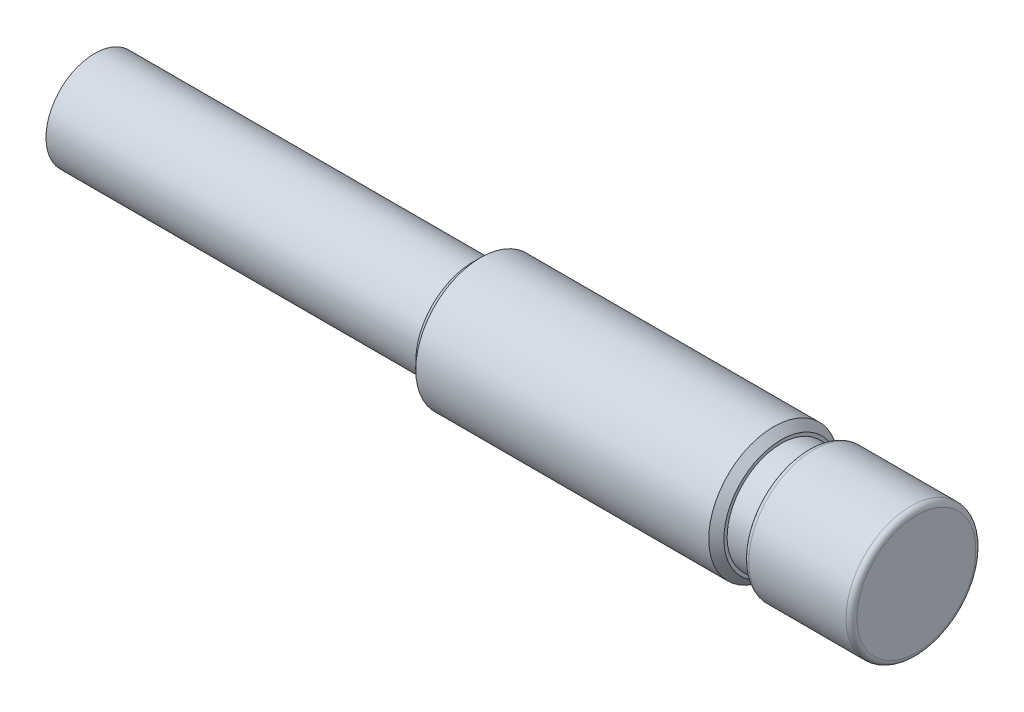
ISO-10303-21;
HEADER;
FILE_DESCRIPTION(('STEP AP214'),'2;1');
FILE_NAME('part.step','',(''),(''),'','','');
FILE_SCHEMA(('AUTOMOTIVE_DESIGN { 1 0 10303 214 1 1 1 1 }'));
ENDSEC;
DATA;
#1=APPLICATION_CONTEXT('core data for automotive mechanical design processes');
#2=APPLICATION_PROTOCOL_DEFINITION('international standard','automotive_design',2000,#1);
#3=PRODUCT_CONTEXT('',#1,'mechanical');
#4=PRODUCT('Part','Part','',(#3));
#5=PRODUCT_RELATED_PRODUCT_CATEGORY('part','',(#4));
#6=PRODUCT_DEFINITION_FORMATION('','',#4);
#7=PRODUCT_DEFINITION_CONTEXT('part definition',#1,'design');
#8=PRODUCT_DEFINITION('design','',#6,#7);
#9=PRODUCT_DEFINITION_SHAPE('','',#8);
#10=(LENGTH_UNIT() NAMED_UNIT(*) SI_UNIT(.MILLI.,.METRE.));
#11=(NAMED_UNIT(*) PLANE_ANGLE_UNIT() SI_UNIT($,.RADIAN.));
#12=(NAMED_UNIT(*) SI_UNIT($,.STERADIAN.) SOLID_ANGLE_UNIT());
#13=UNCERTAINTY_MEASURE_WITH_UNIT(LENGTH_MEASURE(1.E-05),#10,'distance_accuracy_value','');
#14=(GEOMETRIC_REPRESENTATION_CONTEXT(3) GLOBAL_UNCERTAINTY_ASSIGNED_CONTEXT((#13)) GLOBAL_UNIT_ASSIGNED_CONTEXT((#10,
#11,#12)) REPRESENTATION_CONTEXT('',''));
#15=CARTESIAN_POINT('',(0.,0.,0.));
#16=DIRECTION('',(0.,0.,1.));
#17=DIRECTION('',(1.,0.,0.));
#18=AXIS2_PLACEMENT_3D('',#15,#16,#17);
#19=CARTESIAN_POINT('',(0.,0.,0.));
#20=DIRECTION('',(-1.,0.,0.));
#21=DIRECTION('',(0.,-1.,0.));
#22=AXIS2_PLACEMENT_3D('',#19,#20,#21);
#23=PLANE('',#22);
#24=CARTESIAN_POINT('',(0.,0.,0.));
#25=DIRECTION('',(-1.,0.,0.));
#26=DIRECTION('',(0.,-1.,0.));
#27=AXIS2_PLACEMENT_3D('',#24,#25,#26);
#28=CIRCLE('',#27,4.20000000000002);
#29=CARTESIAN_POINT('',(0.,-4.20000000000001,0.));
#30=VERTEX_POINT('',#29);
#31=EDGE_CURVE('E43',#30,#30,#28,.F.);
#32=ORIENTED_EDGE('',*,*,#31,.T.);
#33=EDGE_LOOP('',(#32));
#34=FACE_BOUND('',#33,.T.);
#35=CARTESIAN_POINT('',(0.,0.,0.));
#36=DIRECTION('',(1.,0.,0.));
#37=DIRECTION('',(0.,1.,0.));
#38=AXIS2_PLACEMENT_3D('',#35,#36,#37);
#39=CIRCLE('',#38,4.5);
#40=CARTESIAN_POINT('',(0.,4.5,0.));
#41=VERTEX_POINT('',#40);
#42=EDGE_CURVE('E77',#41,#41,#39,.T.);
#43=ORIENTED_EDGE('',*,*,#42,.F.);
#44=EDGE_LOOP('',(#43));
#45=FACE_BOUND('',#44,.T.);
#46=ADVANCED_FACE('F36',(#34,#45),#23,.T.);
#47=CARTESIAN_POINT('',(76.,0.,0.));
#48=DIRECTION('',(1.,0.,0.));
#49=DIRECTION('',(0.,1.,0.));
#50=AXIS2_PLACEMENT_3D('',#47,#48,#49);
#51=CYLINDRICAL_SURFACE('',#50,4.5);
#52=ORIENTED_EDGE('',*,*,#42,.T.);
#53=EDGE_LOOP('',(#52));
#54=FACE_BOUND('',#53,.T.);
#55=CARTESIAN_POINT('',(35.,0.,0.));
#56=DIRECTION('',(1.,0.,0.));
#57=DIRECTION('',(0.,1.,0.));
#58=AXIS2_PLACEMENT_3D('',#55,#56,#57);
#59=CIRCLE('',#58,4.5);
#60=CARTESIAN_POINT('',(35.,4.5,0.));
#61=VERTEX_POINT('',#60);
#62=EDGE_CURVE('E80',#61,#61,#59,.T.);
#63=ORIENTED_EDGE('',*,*,#62,.F.);
#64=EDGE_LOOP('',(#63));
#65=FACE_BOUND('',#64,.T.);
#66=ADVANCED_FACE('F108',(#54,#65),#51,.T.);
#67=CARTESIAN_POINT('',(35.,4.5,0.));
#68=DIRECTION('',(-1.,0.,0.));
#69=DIRECTION('',(0.,-1.,0.));
#70=AXIS2_PLACEMENT_3D('',#67,#68,#69);
#71=PLANE('',#70);
#72=CARTESIAN_POINT('',(35.,0.,0.));
#73=DIRECTION('',(-1.,0.,0.));
#74=DIRECTION('',(0.,-1.,0.));
#75=AXIS2_PLACEMENT_3D('',#72,#73,#74);
#76=CIRCLE('',#75,5.29999999999999);
#77=CARTESIAN_POINT('',(35.,-5.29999999999999,0.));
#78=VERTEX_POINT('',#77);
#79=EDGE_CURVE('E65',#78,#78,#76,.T.);
#80=ORIENTED_EDGE('',*,*,#79,.T.);
#81=EDGE_LOOP('',(#80));
#82=FACE_BOUND('',#81,.T.);
#83=ORIENTED_EDGE('',*,*,#62,.T.);
#84=EDGE_LOOP('',(#83));
#85=FACE_BOUND('',#84,.T.);
#86=ADVANCED_FACE('F113',(#82,#85),#71,.T.);
#87=CARTESIAN_POINT('',(76.,0.,0.));
#88=DIRECTION('',(1.,0.,0.));
#89=DIRECTION('',(0.,1.,0.));
#90=AXIS2_PLACEMENT_3D('',#87,#88,#89);
#91=CYLINDRICAL_SURFACE('',#90,5.99999999999999);
#92=CARTESIAN_POINT('',(62.8,0.,0.));
#93=DIRECTION('',(1.,0.,0.));
#94=DIRECTION('',(0.,1.,0.));
#95=AXIS2_PLACEMENT_3D('',#92,#93,#94);
#96=CIRCLE('',#95,5.99999999999999);
#97=CARTESIAN_POINT('',(62.8,5.99999999999999,0.));
#98=VERTEX_POINT('',#97);
#99=EDGE_CURVE('E68',#98,#98,#96,.F.);
#100=ORIENTED_EDGE('',*,*,#99,.T.);
#101=EDGE_LOOP('',(#100));
#102=FACE_BOUND('',#101,.T.);
#103=CARTESIAN_POINT('',(35.7,0.,0.));
#104=DIRECTION('',(-1.,0.,0.));
#105=DIRECTION('',(0.,-1.,0.));
#106=AXIS2_PLACEMENT_3D('',#103,#104,#105);
#107=CIRCLE('',#106,5.99999999999999);
#108=CARTESIAN_POINT('',(35.7,-5.99999999999999,0.));
#109=VERTEX_POINT('',#108);
#110=EDGE_CURVE('E71',#109,#109,#107,.F.);
#111=ORIENTED_EDGE('',*,*,#110,.T.);
#112=EDGE_LOOP('',(#111));
#113=FACE_BOUND('',#112,.T.);
#114=ADVANCED_FACE('F104',(#102,#113),#91,.T.);
#115=CARTESIAN_POINT('',(63.5,6.,0.));
#116=DIRECTION('',(1.,0.,0.));
#117=DIRECTION('',(0.,1.,0.));
#118=AXIS2_PLACEMENT_3D('',#115,#116,#117);
#119=PLANE('',#118);
#120=CARTESIAN_POINT('',(63.5,0.,0.));
#121=DIRECTION('',(1.,0.,0.));
#122=DIRECTION('',(0.,1.,0.));
#123=AXIS2_PLACEMENT_3D('',#120,#121,#122);
#124=CIRCLE('',#123,5.29999999999999);
#125=CARTESIAN_POINT('',(63.5,5.29999999999999,0.));
#126=VERTEX_POINT('',#125);
#127=EDGE_CURVE('E74',#126,#126,#124,.T.);
#128=ORIENTED_EDGE('',*,*,#127,.T.);
#129=EDGE_LOOP('',(#128));
#130=FACE_BOUND('',#129,.T.);
#131=CARTESIAN_POINT('',(63.5,0.,0.));
#132=DIRECTION('',(1.,0.,0.));
#133=DIRECTION('',(0.,1.,0.));
#134=AXIS2_PLACEMENT_3D('',#131,#132,#133);
#135=CIRCLE('',#134,4.99999999999999);
#136=CARTESIAN_POINT('',(63.5,4.99999999999999,0.));
#137=VERTEX_POINT('',#136);
#138=EDGE_CURVE('E83',#137,#137,#135,.T.);
#139=ORIENTED_EDGE('',*,*,#138,.F.);
#140=EDGE_LOOP('',(#139));
#141=FACE_BOUND('',#140,.T.);
#142=ADVANCED_FACE('F94',(#130,#141),#119,.T.);
#143=CARTESIAN_POINT('',(76.,0.,0.));
#144=DIRECTION('',(1.,0.,0.));
#145=DIRECTION('',(0.,1.,0.));
#146=AXIS2_PLACEMENT_3D('',#143,#144,#145);
#147=CYLINDRICAL_SURFACE('',#146,4.99999999999999);
#148=ORIENTED_EDGE('',*,*,#138,.T.);
#149=EDGE_LOOP('',(#148));
#150=FACE_BOUND('',#149,.T.);
#151=CARTESIAN_POINT('',(66.,0.,0.));
#152=DIRECTION('',(1.,0.,0.));
#153=DIRECTION('',(0.,1.,0.));
#154=AXIS2_PLACEMENT_3D('',#151,#152,#153);
#155=CIRCLE('',#154,4.99999999999999);
#156=CARTESIAN_POINT('',(66.,4.99999999999999,0.));
#157=VERTEX_POINT('',#156);
#158=EDGE_CURVE('E86',#157,#157,#155,.T.);
#159=ORIENTED_EDGE('',*,*,#158,.F.);
#160=EDGE_LOOP('',(#159));
#161=FACE_BOUND('',#160,.T.);
#162=ADVANCED_FACE('F92',(#150,#161),#147,.T.);
#163=CARTESIAN_POINT('',(66.,4.99999999999999,0.));
#164=DIRECTION('',(-1.,0.,0.));
#165=DIRECTION('',(0.,-1.,0.));
#166=AXIS2_PLACEMENT_3D('',#163,#164,#165);
#167=PLANE('',#166);
#168=CARTESIAN_POINT('',(66.,0.,0.));
#169=DIRECTION('',(-1.,0.,0.));
#170=DIRECTION('',(0.,-1.,0.));
#171=AXIS2_PLACEMENT_3D('',#168,#169,#170);
#172=CIRCLE('',#171,5.49999999999999);
#173=CARTESIAN_POINT('',(66.,-5.49999999999999,0.));
#174=VERTEX_POINT('',#173);
#175=EDGE_CURVE('E51',#174,#174,#172,.T.);
#176=ORIENTED_EDGE('',*,*,#175,.T.);
#177=EDGE_LOOP('',(#176));
#178=FACE_BOUND('',#177,.T.);
#179=ORIENTED_EDGE('',*,*,#158,.T.);
#180=EDGE_LOOP('',(#179));
#181=FACE_BOUND('',#180,.T.);
#182=ADVANCED_FACE('F90',(#178,#181),#167,.T.);
#183=CARTESIAN_POINT('',(76.,0.,0.));
#184=DIRECTION('',(1.,0.,0.));
#185=DIRECTION('',(0.,1.,0.));
#186=AXIS2_PLACEMENT_3D('',#183,#184,#185);
#187=CYLINDRICAL_SURFACE('',#186,5.99999999999999);
#188=CARTESIAN_POINT('',(75.5,0.,0.));
#189=DIRECTION('',(1.,0.,0.));
#190=DIRECTION('',(0.,1.,0.));
#191=AXIS2_PLACEMENT_3D('',#188,#189,#190);
#192=CIRCLE('',#191,5.99999999999999);
#193=CARTESIAN_POINT('',(75.5,5.99999999999999,0.));
#194=VERTEX_POINT('',#193);
#195=EDGE_CURVE('E56',#194,#194,#192,.F.);
#196=ORIENTED_EDGE('',*,*,#195,.T.);
#197=EDGE_LOOP('',(#196));
#198=FACE_BOUND('',#197,.T.);
#199=CARTESIAN_POINT('',(66.5,0.,0.));
#200=DIRECTION('',(-1.,0.,0.));
#201=DIRECTION('',(0.,-1.,0.));
#202=AXIS2_PLACEMENT_3D('',#199,#200,#201);
#203=CIRCLE('',#202,5.99999999999999);
#204=CARTESIAN_POINT('',(66.5,-5.99999999999999,0.));
#205=VERTEX_POINT('',#204);
#206=EDGE_CURVE('E59',#205,#205,#203,.F.);
#207=ORIENTED_EDGE('',*,*,#206,.T.);
#208=EDGE_LOOP('',(#207));
#209=FACE_BOUND('',#208,.T.);
#210=ADVANCED_FACE('F101',(#198,#209),#187,.T.);
#211=CARTESIAN_POINT('',(76.,6.,0.));
#212=DIRECTION('',(1.,0.,0.));
#213=DIRECTION('',(0.,1.,0.));
#214=AXIS2_PLACEMENT_3D('',#211,#212,#213);
#215=PLANE('',#214);
#216=CARTESIAN_POINT('',(76.,0.,0.));
#217=DIRECTION('',(1.,0.,0.));
#218=DIRECTION('',(0.,1.,0.));
#219=AXIS2_PLACEMENT_3D('',#216,#217,#218);
#220=CIRCLE('',#219,5.49999999999999);
#221=CARTESIAN_POINT('',(76.,5.49999999999999,0.));
#222=VERTEX_POINT('',#221);
#223=EDGE_CURVE('E62',#222,#222,#220,.T.);
#224=ORIENTED_EDGE('',*,*,#223,.T.);
#225=EDGE_LOOP('',(#224));
#226=FACE_BOUND('',#225,.T.);
#227=ADVANCED_FACE('F123',(#226),#215,.T.);
#228=CARTESIAN_POINT('',(63.5,0.,0.));
#229=DIRECTION('',(-1.,0.,0.));
#230=DIRECTION('',(0.,-1.,0.));
#231=AXIS2_PLACEMENT_3D('',#228,#229,#230);
#232=CONICAL_SURFACE('',#231,5.29999999999999,0.785398163397441);
#233=ORIENTED_EDGE('',*,*,#99,.F.);
#234=EDGE_LOOP('',(#233));
#235=FACE_BOUND('',#234,.T.);
#236=ORIENTED_EDGE('',*,*,#127,.F.);
#237=EDGE_LOOP('',(#236));
#238=FACE_BOUND('',#237,.T.);
#239=ADVANCED_FACE('F119',(#235,#238),#232,.T.);
#240=CARTESIAN_POINT('',(35.7,0.,0.));
#241=DIRECTION('',(1.,0.,0.));
#242=DIRECTION('',(0.,1.,0.));
#243=AXIS2_PLACEMENT_3D('',#240,#241,#242);
#244=CONICAL_SURFACE('',#243,5.99999999999999,0.785398163397451);
#245=ORIENTED_EDGE('',*,*,#79,.F.);
#246=EDGE_LOOP('',(#245));
#247=FACE_BOUND('',#246,.T.);
#248=ORIENTED_EDGE('',*,*,#110,.F.);
#249=EDGE_LOOP('',(#248));
#250=FACE_BOUND('',#249,.T.);
#251=ADVANCED_FACE('F122',(#247,#250),#244,.T.);
#252=CARTESIAN_POINT('',(75.5,0.,0.));
#253=DIRECTION('',(1.,0.,0.));
#254=DIRECTION('',(0.,1.,0.));
#255=AXIS2_PLACEMENT_3D('',#252,#253,#254);
#256=TOROIDAL_SURFACE('',#255,5.49999999999999,0.5);
#257=ORIENTED_EDGE('',*,*,#195,.F.);
#258=EDGE_LOOP('',(#257));
#259=FACE_BOUND('',#258,.T.);
#260=ORIENTED_EDGE('',*,*,#223,.F.);
#261=EDGE_LOOP('',(#260));
#262=FACE_BOUND('',#261,.T.);
#263=ADVANCED_FACE('F127',(#259,#262),#256,.T.);
#264=CARTESIAN_POINT('',(66.5,0.,0.));
#265=DIRECTION('',(-1.,0.,0.));
#266=DIRECTION('',(0.,-1.,0.));
#267=AXIS2_PLACEMENT_3D('',#264,#265,#266);
#268=TOROIDAL_SURFACE('',#267,5.49999999999999,0.5);
#269=ORIENTED_EDGE('',*,*,#175,.F.);
#270=EDGE_LOOP('',(#269));
#271=FACE_BOUND('',#270,.T.);
#272=ORIENTED_EDGE('',*,*,#206,.F.);
#273=EDGE_LOOP('',(#272));
#274=FACE_BOUND('',#273,.T.);
#275=ADVANCED_FACE('F131',(#271,#274),#268,.T.);
#276=CARTESIAN_POINT('',(3.,0.,0.));
#277=DIRECTION('',(-1.,0.,0.));
#278=DIRECTION('',(0.,-1.,0.));
#279=AXIS2_PLACEMENT_3D('',#276,#277,#278);
#280=PLANE('',#279);
#281=CARTESIAN_POINT('',(3.,0.,0.));
#282=DIRECTION('',(-1.,0.,0.));
#283=DIRECTION('',(0.,-1.,0.));
#284=AXIS2_PLACEMENT_3D('',#281,#282,#283);
#285=CIRCLE('',#284,0.151000400320339);
#286=CARTESIAN_POINT('',(3.,-0.151000400320339,0.));
#287=VERTEX_POINT('',#286);
#288=EDGE_CURVE('E10',#287,#287,#285,.T.);
#289=ORIENTED_EDGE('',*,*,#288,.T.);
#290=EDGE_LOOP('',(#289));
#291=FACE_BOUND('',#290,.T.);
#292=ADVANCED_FACE('F134',(#291),#280,.T.);
#293=CARTESIAN_POINT('',(2.8,0.,0.));
#294=DIRECTION('',(-1.,0.,0.));
#295=DIRECTION('',(0.,-1.,0.));
#296=AXIS2_PLACEMENT_3D('',#293,#294,#295);
#297=CONICAL_SURFACE('',#296,1.4,0.78539816339745);
#298=CARTESIAN_POINT('',(2.8,0.,0.));
#299=DIRECTION('',(-1.,0.,0.));
#300=DIRECTION('',(0.,-1.,0.));
#301=AXIS2_PLACEMENT_3D('',#298,#299,#300);
#302=CIRCLE('',#301,1.4);
#303=CARTESIAN_POINT('',(2.8,-1.4,0.));
#304=VERTEX_POINT('',#303);
#305=EDGE_CURVE('E47',#304,#304,#302,.T.);
#306=CARTESIAN_POINT('',(0.,-4.20000000000001,0.));
#307=CARTESIAN_POINT('',(0.0291666666666665,-4.17083333333334,0.));
#308=CARTESIAN_POINT('',(0.0583333333333332,-4.14166666666667,0.));
#309=CARTESIAN_POINT('',(0.116666666666667,-4.08333333333334,0.));
#310=CARTESIAN_POINT('',(0.145833333333333,-4.05416666666667,0.));
#311=CARTESIAN_POINT('',(0.204166666666666,-3.99583333333334,0.));
#312=CARTESIAN_POINT('',(0.233333333333333,-3.96666666666667,0.));
#313=CARTESIAN_POINT('',(0.291666666666666,-3.90833333333334,0.));
#314=CARTESIAN_POINT('',(0.320833333333333,-3.87916666666667,0.));
#315=CARTESIAN_POINT('',(0.379166666666666,-3.82083333333334,0.));
#316=CARTESIAN_POINT('',(0.408333333333333,-3.79166666666667,0.));
#317=CARTESIAN_POINT('',(0.466666666666666,-3.73333333333334,0.));
#318=CARTESIAN_POINT('',(0.495833333333333,-3.70416666666667,0.));
#319=CARTESIAN_POINT('',(0.554166666666666,-3.64583333333334,0.));
#320=CARTESIAN_POINT('',(0.583333333333333,-3.61666666666667,0.));
#321=CARTESIAN_POINT('',(0.641666666666666,-3.55833333333334,0.));
#322=CARTESIAN_POINT('',(0.670833333333333,-3.52916666666667,0.));
#323=CARTESIAN_POINT('',(0.729166666666666,-3.47083333333334,0.));
#324=CARTESIAN_POINT('',(0.758333333333332,-3.44166666666667,0.));
#325=CARTESIAN_POINT('',(0.816666666666666,-3.38333333333334,0.));
#326=CARTESIAN_POINT('',(0.845833333333332,-3.35416666666667,0.));
#327=CARTESIAN_POINT('',(0.904166666666666,-3.29583333333334,0.));
#328=CARTESIAN_POINT('',(0.933333333333332,-3.26666666666667,0.));
#329=CARTESIAN_POINT('',(0.991666666666665,-3.20833333333334,0.));
#330=CARTESIAN_POINT('',(1.02083333333333,-3.17916666666667,0.));
#331=CARTESIAN_POINT('',(1.07916666666667,-3.12083333333334,0.));
#332=CARTESIAN_POINT('',(1.10833333333333,-3.09166666666667,0.));
#333=CARTESIAN_POINT('',(1.16666666666667,-3.03333333333334,0.));
#334=CARTESIAN_POINT('',(1.19583333333333,-3.00416666666667,0.));
#335=CARTESIAN_POINT('',(1.25416666666667,-2.94583333333334,0.));
#336=CARTESIAN_POINT('',(1.28333333333333,-2.91666666666667,0.));
#337=CARTESIAN_POINT('',(1.34166666666666,-2.85833333333334,0.));
#338=CARTESIAN_POINT('',(1.37083333333333,-2.82916666666667,0.));
#339=CARTESIAN_POINT('',(1.42916666666666,-2.77083333333334,0.));
#340=CARTESIAN_POINT('',(1.45833333333333,-2.74166666666667,0.));
#341=CARTESIAN_POINT('',(1.51666666666666,-2.68333333333334,0.));
#342=CARTESIAN_POINT('',(1.54583333333333,-2.65416666666667,0.));
#343=CARTESIAN_POINT('',(1.60416666666666,-2.59583333333334,0.));
#344=CARTESIAN_POINT('',(1.63333333333333,-2.56666666666667,0.));
#345=CARTESIAN_POINT('',(1.69166666666666,-2.50833333333334,0.));
#346=CARTESIAN_POINT('',(1.72083333333333,-2.47916666666667,0.));
#347=CARTESIAN_POINT('',(1.77916666666666,-2.42083333333334,0.));
#348=CARTESIAN_POINT('',(1.80833333333333,-2.39166666666667,0.));
#349=CARTESIAN_POINT('',(1.86666666666666,-2.33333333333334,0.));
#350=CARTESIAN_POINT('',(1.89583333333333,-2.30416666666667,0.));
#351=CARTESIAN_POINT('',(1.95416666666666,-2.24583333333334,0.));
#352=CARTESIAN_POINT('',(1.98333333333333,-2.21666666666667,0.));
#353=CARTESIAN_POINT('',(2.04166666666666,-2.15833333333334,0.));
#354=CARTESIAN_POINT('',(2.07083333333333,-2.12916666666667,0.));
#355=CARTESIAN_POINT('',(2.12916666666666,-2.07083333333334,0.));
#356=CARTESIAN_POINT('',(2.15833333333333,-2.04166666666667,0.));
#357=CARTESIAN_POINT('',(2.21666666666666,-1.98333333333333,0.));
#358=CARTESIAN_POINT('',(2.24583333333333,-1.95416666666667,0.));
#359=CARTESIAN_POINT('',(2.30416666666666,-1.89583333333333,0.));
#360=CARTESIAN_POINT('',(2.33333333333333,-1.86666666666667,0.));
#361=CARTESIAN_POINT('',(2.39166666666666,-1.80833333333333,0.));
#362=CARTESIAN_POINT('',(2.42083333333333,-1.77916666666667,0.));
#363=CARTESIAN_POINT('',(2.47916666666666,-1.72083333333333,0.));
#364=CARTESIAN_POINT('',(2.50833333333333,-1.69166666666667,0.));
#365=CARTESIAN_POINT('',(2.56666666666666,-1.63333333333333,0.));
#366=CARTESIAN_POINT('',(2.59583333333333,-1.60416666666667,0.));
#367=CARTESIAN_POINT('',(2.65416666666666,-1.54583333333333,0.));
#368=CARTESIAN_POINT('',(2.68333333333333,-1.51666666666667,0.));
#369=CARTESIAN_POINT('',(2.74166666666666,-1.45833333333333,0.));
#370=CARTESIAN_POINT('',(2.77083333333333,-1.42916666666667,0.));
#371=CARTESIAN_POINT('',(2.8,-1.4,0.));
#372=B_SPLINE_CURVE_WITH_KNOTS('',3,(#306,#307,#308,#309,#310,#311,#312,#313,#314,#315,#316,
#317,#318,#319,#320,#321,#322,#323,#324,#325,#326,#327,#328,#329,#330,#331,#332,#333,#334,#335,
#336,#337,#338,#339,#340,#341,#342,#343,#344,#345,#346,#347,#348,#349,#350,#351,#352,#353,#354,
#355,#356,#357,#358,#359,#360,#361,#362,#363,#364,#365,#366,#367,#368,#369,#370,#371),
.UNSPECIFIED.,.F.,.F.,(4,2,2,2,2,2,2,2,2,2,2,2,2,2,2,2,2,2,2,2,2,2,2,2,2,2,2,2,2,2,2,2,4),(0.,
0.123743686707646,0.247487373415292,0.371231060122938,0.494974746830583,0.61871843353823,
0.742462120245875,0.866205806953521,0.989949493661167,1.11369318036881,1.23743686707646,
1.36118055378411,1.48492424049175,1.6086679271994,1.73241161390704,1.85615530061469,
1.97989898732233,2.10364267402998,2.22738636073763,2.35113004744527,2.47487373415292,
2.59861742086056,2.72236110756821,2.84610479427585,2.9698484809835,3.09359216769115,
3.21733585439879,3.34107954110644,3.46482322781408,3.58856691452173,3.71231060122938,
3.83605428793702,3.95979797464467),.UNSPECIFIED.);
#373=EDGE_CURVE('BSEAM136',#30,#304,#372,.T.);
#374=ORIENTED_EDGE('',*,*,#31,.F.);
#375=ORIENTED_EDGE('',*,*,#305,.F.);
#376=ORIENTED_EDGE('',*,*,#373,.T.);
#377=ORIENTED_EDGE('',*,*,#373,.F.);
#378=EDGE_LOOP('',(#374,#376,#375,#377));
#379=FACE_BOUND('',#378,.T.);
#380=ADVANCED_FACE('F136',(#379),#297,.F.);
#381=CARTESIAN_POINT('',(-1.,0.,0.));
#382=DIRECTION('',(1.,0.,0.));
#383=DIRECTION('',(0.,1.,0.));
#384=AXIS2_PLACEMENT_3D('',#381,#382,#383);
#385=DEGENERATE_TOROIDAL_SURFACE('',#384,0.151000400320339,4.,.T.);
#386=ORIENTED_EDGE('',*,*,#305,.T.);
#387=EDGE_LOOP('',(#386));
#388=FACE_BOUND('',#387,.T.);
#389=ORIENTED_EDGE('',*,*,#288,.F.);
#390=EDGE_LOOP('',(#389));
#391=FACE_BOUND('',#390,.T.);
#392=ADVANCED_FACE('F38',(#388,#391),#385,.F.);
#393=CLOSED_SHELL('',(#46,#66,#86,#114,#142,#162,#182,#210,#227,#239,#251,#263,#275,#292,#380,#392));
#394=MANIFOLD_SOLID_BREP('B2',#393);
#395=ADVANCED_BREP_SHAPE_REPRESENTATION('',(#18,#394),#14);
#396=SHAPE_DEFINITION_REPRESENTATION(#9,#395);
ENDSEC;
END-ISO-10303-21;
